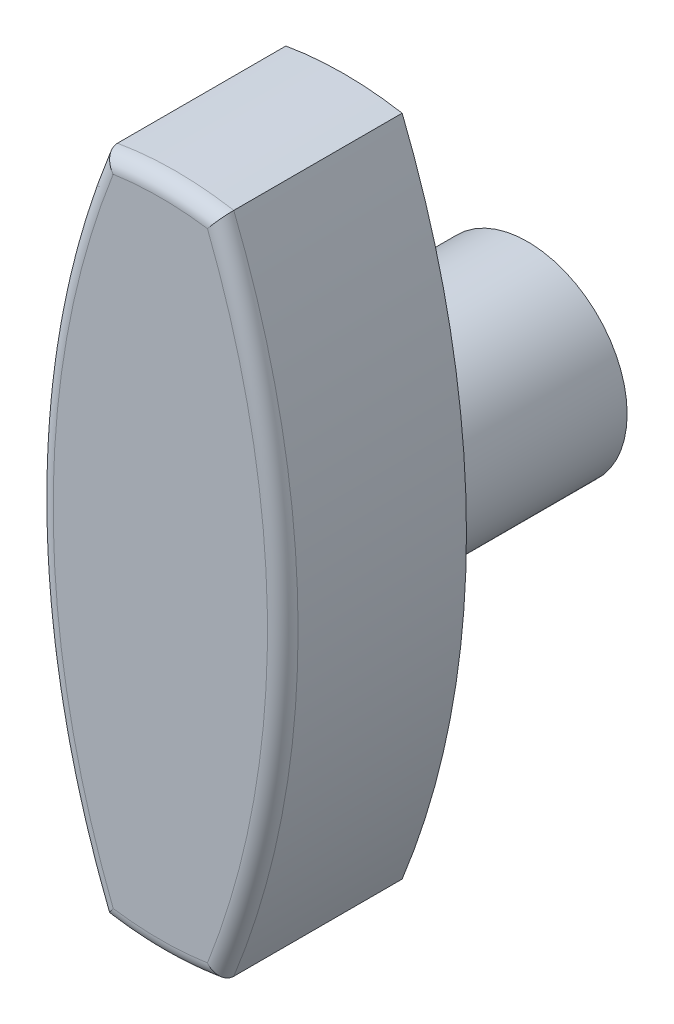
ISO-10303-21;
HEADER;
FILE_DESCRIPTION(('STEP AP214'),'2;1');
FILE_NAME('part.step','',(''),(''),'','','');
FILE_SCHEMA(('AUTOMOTIVE_DESIGN { 1 0 10303 214 1 1 1 1 }'));
ENDSEC;
DATA;
#1=APPLICATION_CONTEXT('core data for automotive mechanical design processes');
#2=APPLICATION_PROTOCOL_DEFINITION('international standard','automotive_design',2000,#1);
#3=PRODUCT_CONTEXT('',#1,'mechanical');
#4=PRODUCT('Part','Part','',(#3));
#5=PRODUCT_RELATED_PRODUCT_CATEGORY('part','',(#4));
#6=PRODUCT_DEFINITION_FORMATION('','',#4);
#7=PRODUCT_DEFINITION_CONTEXT('part definition',#1,'design');
#8=PRODUCT_DEFINITION('design','',#6,#7);
#9=PRODUCT_DEFINITION_SHAPE('','',#8);
#10=(LENGTH_UNIT() NAMED_UNIT(*) SI_UNIT(.MILLI.,.METRE.));
#11=(NAMED_UNIT(*) PLANE_ANGLE_UNIT() SI_UNIT($,.RADIAN.));
#12=(NAMED_UNIT(*) SI_UNIT($,.STERADIAN.) SOLID_ANGLE_UNIT());
#13=UNCERTAINTY_MEASURE_WITH_UNIT(LENGTH_MEASURE(1.E-05),#10,'distance_accuracy_value','');
#14=(GEOMETRIC_REPRESENTATION_CONTEXT(3) GLOBAL_UNCERTAINTY_ASSIGNED_CONTEXT((#13)) GLOBAL_UNIT_ASSIGNED_CONTEXT((#10,
#11,#12)) REPRESENTATION_CONTEXT('',''));
#15=CARTESIAN_POINT('',(0.,0.,0.));
#16=DIRECTION('',(0.,0.,1.));
#17=DIRECTION('',(1.,0.,0.));
#18=AXIS2_PLACEMENT_3D('',#15,#16,#17);
#19=CARTESIAN_POINT('',(0.,0.,0.));
#20=DIRECTION('',(0.,0.,1.));
#21=DIRECTION('',(1.,0.,0.));
#22=AXIS2_PLACEMENT_3D('',#19,#20,#21);
#23=PLANE('',#22);
#24=CARTESIAN_POINT('',(0.,0.,0.));
#25=DIRECTION('',(0.,0.,1.));
#26=DIRECTION('',(1.,0.,0.));
#27=AXIS2_PLACEMENT_3D('',#24,#25,#26);
#28=CIRCLE('',#27,6.5);
#29=CARTESIAN_POINT('',(6.5,0.,0.));
#30=VERTEX_POINT('',#29);
#31=EDGE_CURVE('E175',#30,#30,#28,.T.);
#32=ORIENTED_EDGE('',*,*,#31,.F.);
#33=EDGE_LOOP('',(#32));
#34=FACE_BOUND('',#33,.T.);
#35=CARTESIAN_POINT('',(0.,0.,0.));
#36=DIRECTION('',(0.,0.,1.));
#37=DIRECTION('',(-1.,0.,0.));
#38=AXIS2_PLACEMENT_3D('',#35,#36,#37);
#39=CIRCLE('',#38,4.);
#40=CARTESIAN_POINT('',(2.64575131106459,-3.,0.));
#41=VERTEX_POINT('',#40);
#42=CARTESIAN_POINT('',(-2.64575131106459,-3.,0.));
#43=VERTEX_POINT('',#42);
#44=EDGE_CURVE('E118',#41,#43,#39,.T.);
#45=ORIENTED_EDGE('',*,*,#44,.T.);
#46=DIRECTION('',(1.,0.,0.));
#47=VECTOR('',#46,1.);
#48=CARTESIAN_POINT('',(-2.64575131106459,-3.,0.));
#49=LINE('',#48,#47);
#50=EDGE_CURVE('E157',#43,#41,#49,.T.);
#51=ORIENTED_EDGE('',*,*,#50,.T.);
#52=EDGE_LOOP('',(#45,#51));
#53=FACE_BOUND('',#52,.T.);
#54=ADVANCED_FACE('F39',(#34,#53),#23,.F.);
#55=CARTESIAN_POINT('',(0.,0.,12.));
#56=DIRECTION('',(0.,0.,-1.));
#57=DIRECTION('',(-1.,0.,0.));
#58=AXIS2_PLACEMENT_3D('',#55,#56,#57);
#59=CYLINDRICAL_SURFACE('',#58,6.5);
#60=CARTESIAN_POINT('',(0.,0.,12.));
#61=DIRECTION('',(0.,0.,1.));
#62=DIRECTION('',(1.,0.,0.));
#63=AXIS2_PLACEMENT_3D('',#60,#61,#62);
#64=CIRCLE('',#63,6.5);
#65=CARTESIAN_POINT('',(6.5,0.,12.));
#66=VERTEX_POINT('',#65);
#67=EDGE_CURVE('E176',#66,#66,#64,.T.);
#68=ORIENTED_EDGE('',*,*,#67,.F.);
#69=EDGE_LOOP('',(#68));
#70=FACE_BOUND('',#69,.T.);
#71=ORIENTED_EDGE('',*,*,#31,.T.);
#72=EDGE_LOOP('',(#71));
#73=FACE_BOUND('',#72,.T.);
#74=ADVANCED_FACE('F263',(#70,#73),#59,.T.);
#75=CARTESIAN_POINT('',(0.,0.,12.));
#76=DIRECTION('',(0.,0.,-1.));
#77=DIRECTION('',(-1.,0.,0.));
#78=AXIS2_PLACEMENT_3D('',#75,#76,#77);
#79=CYLINDRICAL_SURFACE('',#78,4.);
#80=ORIENTED_EDGE('',*,*,#44,.F.);
#81=DIRECTION('',(0.,0.,-1.));
#82=VECTOR('',#81,1.);
#83=CARTESIAN_POINT('',(2.64575131106459,-3.,12.));
#84=LINE('',#83,#82);
#85=CARTESIAN_POINT('',(2.64575131106459,-3.,12.));
#86=VERTEX_POINT('',#85);
#87=EDGE_CURVE('E161',#86,#41,#84,.T.);
#88=ORIENTED_EDGE('',*,*,#87,.F.);
#89=CARTESIAN_POINT('',(0.,0.,12.));
#90=DIRECTION('',(0.,0.,1.));
#91=DIRECTION('',(-1.,0.,0.));
#92=AXIS2_PLACEMENT_3D('',#89,#90,#91);
#93=CIRCLE('',#92,4.);
#94=CARTESIAN_POINT('',(-2.64575131106459,-3.,12.));
#95=VERTEX_POINT('',#94);
#96=EDGE_CURVE('E152',#86,#95,#93,.T.);
#97=ORIENTED_EDGE('',*,*,#96,.T.);
#98=DIRECTION('',(0.,0.,-1.));
#99=VECTOR('',#98,1.);
#100=CARTESIAN_POINT('',(-2.64575131106459,-3.,12.));
#101=LINE('',#100,#99);
#102=EDGE_CURVE('E171',#95,#43,#101,.T.);
#103=ORIENTED_EDGE('',*,*,#102,.T.);
#104=EDGE_LOOP('',(#80,#88,#97,#103));
#105=FACE_BOUND('',#104,.T.);
#106=ADVANCED_FACE('F269',(#105),#79,.F.);
#107=CARTESIAN_POINT('',(-2.64575131106459,-3.,12.));
#108=DIRECTION('',(0.,1.,0.));
#109=DIRECTION('',(0.,0.,1.));
#110=AXIS2_PLACEMENT_3D('',#107,#108,#109);
#111=PLANE('',#110);
#112=ORIENTED_EDGE('',*,*,#50,.F.);
#113=ORIENTED_EDGE('',*,*,#102,.F.);
#114=DIRECTION('',(1.,0.,0.));
#115=VECTOR('',#114,1.);
#116=CARTESIAN_POINT('',(-2.64575131106459,-3.,12.));
#117=LINE('',#116,#115);
#118=EDGE_CURVE('E156',#95,#86,#117,.T.);
#119=ORIENTED_EDGE('',*,*,#118,.T.);
#120=ORIENTED_EDGE('',*,*,#87,.T.);
#121=EDGE_LOOP('',(#112,#113,#119,#120));
#122=FACE_BOUND('',#121,.T.);
#123=ADVANCED_FACE('F276',(#122),#111,.T.);
#124=CARTESIAN_POINT('',(25.,0.,12.));
#125=DIRECTION('',(0.,0.,1.));
#126=DIRECTION('',(1.,0.,0.));
#127=AXIS2_PLACEMENT_3D('',#124,#125,#126);
#128=PLANE('',#127);
#129=ORIENTED_EDGE('',*,*,#118,.F.);
#130=ORIENTED_EDGE('',*,*,#96,.F.);
#131=EDGE_LOOP('',(#129,#130));
#132=FACE_BOUND('',#131,.T.);
#133=ADVANCED_FACE('F260',(#132),#128,.F.);
#134=CARTESIAN_POINT('',(0.,0.,24.));
#135=DIRECTION('',(0.,0.,-1.));
#136=DIRECTION('',(-1.,0.,0.));
#137=AXIS2_PLACEMENT_3D('',#134,#135,#136);
#138=CYLINDRICAL_SURFACE('',#137,22.);
#139=DIRECTION('',(0.,0.,-1.));
#140=VECTOR('',#139,1.);
#141=CARTESIAN_POINT('',(-3.79999999999999,21.669333169251,24.));
#142=LINE('',#141,#140);
#143=CARTESIAN_POINT('',(-3.79999999999999,21.669333169251,23.));
#144=VERTEX_POINT('',#143);
#145=CARTESIAN_POINT('',(-3.79999999999999,21.669333169251,12.));
#146=VERTEX_POINT('',#145);
#147=EDGE_CURVE('E109',#144,#146,#142,.T.);
#148=ORIENTED_EDGE('',*,*,#147,.F.);
#149=CARTESIAN_POINT('',(0.,0.,23.));
#150=DIRECTION('',(0.,0.,1.));
#151=DIRECTION('',(1.,0.,0.));
#152=AXIS2_PLACEMENT_3D('',#149,#150,#151);
#153=CIRCLE('',#152,22.);
#154=CARTESIAN_POINT('',(3.79999999999999,21.669333169251,23.));
#155=VERTEX_POINT('',#154);
#156=EDGE_CURVE('E11',#144,#155,#153,.F.);
#157=ORIENTED_EDGE('',*,*,#156,.T.);
#158=DIRECTION('',(0.,0.,-1.));
#159=VECTOR('',#158,1.);
#160=CARTESIAN_POINT('',(3.79999999999999,21.669333169251,24.));
#161=LINE('',#160,#159);
#162=CARTESIAN_POINT('',(3.79999999999999,21.669333169251,12.));
#163=VERTEX_POINT('',#162);
#164=EDGE_CURVE('E132',#155,#163,#161,.T.);
#165=ORIENTED_EDGE('',*,*,#164,.T.);
#166=CARTESIAN_POINT('',(0.,0.,12.));
#167=DIRECTION('',(0.,0.,1.));
#168=DIRECTION('',(1.,0.,0.));
#169=AXIS2_PLACEMENT_3D('',#166,#167,#168);
#170=CIRCLE('',#169,22.);
#171=EDGE_CURVE('E125',#163,#146,#170,.T.);
#172=ORIENTED_EDGE('',*,*,#171,.T.);
#173=EDGE_LOOP('',(#148,#157,#165,#172));
#174=FACE_BOUND('',#173,.T.);
#175=ADVANCED_FACE('F130',(#174),#138,.T.);
#176=CARTESIAN_POINT('',(50.,0.,24.));
#177=DIRECTION('',(0.,0.,-1.));
#178=DIRECTION('',(-1.,0.,0.));
#179=AXIS2_PLACEMENT_3D('',#176,#177,#178);
#180=CYLINDRICAL_SURFACE('',#179,58.);
#181=DIRECTION('',(0.,0.,-1.));
#182=VECTOR('',#181,1.);
#183=CARTESIAN_POINT('',(-3.79999999999999,-21.669333169251,24.));
#184=LINE('',#183,#182);
#185=CARTESIAN_POINT('',(-3.79999999999999,-21.669333169251,23.));
#186=VERTEX_POINT('',#185);
#187=CARTESIAN_POINT('',(-3.79999999999999,-21.669333169251,12.));
#188=VERTEX_POINT('',#187);
#189=EDGE_CURVE('E119',#186,#188,#184,.T.);
#190=ORIENTED_EDGE('',*,*,#189,.F.);
#191=CARTESIAN_POINT('',(50.,0.,23.));
#192=DIRECTION('',(0.,0.,1.));
#193=DIRECTION('',(1.,0.,0.));
#194=AXIS2_PLACEMENT_3D('',#191,#192,#193);
#195=CIRCLE('',#194,58.);
#196=EDGE_CURVE('E54',#186,#144,#195,.F.);
#197=ORIENTED_EDGE('',*,*,#196,.T.);
#198=ORIENTED_EDGE('',*,*,#147,.T.);
#199=CARTESIAN_POINT('',(50.,0.,12.));
#200=DIRECTION('',(0.,0.,1.));
#201=DIRECTION('',(1.,0.,0.));
#202=AXIS2_PLACEMENT_3D('',#199,#200,#201);
#203=CIRCLE('',#202,58.);
#204=EDGE_CURVE('E112',#146,#188,#203,.T.);
#205=ORIENTED_EDGE('',*,*,#204,.T.);
#206=EDGE_LOOP('',(#190,#197,#198,#205));
#207=FACE_BOUND('',#206,.T.);
#208=ADVANCED_FACE('F111',(#207),#180,.T.);
#209=CARTESIAN_POINT('',(0.,0.,24.));
#210=DIRECTION('',(0.,0.,-1.));
#211=DIRECTION('',(-1.,0.,0.));
#212=AXIS2_PLACEMENT_3D('',#209,#210,#211);
#213=CYLINDRICAL_SURFACE('',#212,22.);
#214=DIRECTION('',(0.,0.,-1.));
#215=VECTOR('',#214,1.);
#216=CARTESIAN_POINT('',(3.8,-21.6693331692509,24.));
#217=LINE('',#216,#215);
#218=CARTESIAN_POINT('',(3.8,-21.6693331692509,23.));
#219=VERTEX_POINT('',#218);
#220=CARTESIAN_POINT('',(3.8,-21.6693331692509,12.));
#221=VERTEX_POINT('',#220);
#222=EDGE_CURVE('E147',#219,#221,#217,.T.);
#223=ORIENTED_EDGE('',*,*,#222,.F.);
#224=CARTESIAN_POINT('',(0.,0.,23.));
#225=DIRECTION('',(0.,0.,1.));
#226=DIRECTION('',(1.,0.,0.));
#227=AXIS2_PLACEMENT_3D('',#224,#225,#226);
#228=CIRCLE('',#227,22.);
#229=EDGE_CURVE('E69',#219,#186,#228,.F.);
#230=ORIENTED_EDGE('',*,*,#229,.T.);
#231=ORIENTED_EDGE('',*,*,#189,.T.);
#232=CARTESIAN_POINT('',(0.,0.,12.));
#233=DIRECTION('',(0.,0.,1.));
#234=DIRECTION('',(-1.,0.,0.));
#235=AXIS2_PLACEMENT_3D('',#232,#233,#234);
#236=CIRCLE('',#235,22.);
#237=EDGE_CURVE('E127',#188,#221,#236,.T.);
#238=ORIENTED_EDGE('',*,*,#237,.T.);
#239=EDGE_LOOP('',(#223,#230,#231,#238));
#240=FACE_BOUND('',#239,.T.);
#241=ADVANCED_FACE('F247',(#240),#213,.T.);
#242=CARTESIAN_POINT('',(-50.,0.,24.));
#243=DIRECTION('',(0.,0.,-1.));
#244=DIRECTION('',(-1.,0.,0.));
#245=AXIS2_PLACEMENT_3D('',#242,#243,#244);
#246=CYLINDRICAL_SURFACE('',#245,58.);
#247=ORIENTED_EDGE('',*,*,#164,.F.);
#248=CARTESIAN_POINT('',(-50.,0.,23.));
#249=DIRECTION('',(0.,0.,1.));
#250=DIRECTION('',(1.,0.,0.));
#251=AXIS2_PLACEMENT_3D('',#248,#249,#250);
#252=CIRCLE('',#251,58.);
#253=EDGE_CURVE('E196',#155,#219,#252,.F.);
#254=ORIENTED_EDGE('',*,*,#253,.T.);
#255=ORIENTED_EDGE('',*,*,#222,.T.);
#256=CARTESIAN_POINT('',(-50.,0.,12.));
#257=DIRECTION('',(0.,0.,1.));
#258=DIRECTION('',(-1.,0.,0.));
#259=AXIS2_PLACEMENT_3D('',#256,#257,#258);
#260=CIRCLE('',#259,58.);
#261=EDGE_CURVE('E142',#221,#163,#260,.T.);
#262=ORIENTED_EDGE('',*,*,#261,.T.);
#263=EDGE_LOOP('',(#247,#254,#255,#262));
#264=FACE_BOUND('',#263,.T.);
#265=ADVANCED_FACE('F246',(#264),#246,.T.);
#266=CARTESIAN_POINT('',(25.,0.,24.));
#267=DIRECTION('',(0.,0.,1.));
#268=DIRECTION('',(1.,0.,0.));
#269=AXIS2_PLACEMENT_3D('',#266,#267,#268);
#270=PLANE('',#269);
#271=CARTESIAN_POINT('',(0.,0.,24.));
#272=DIRECTION('',(0.,0.,1.));
#273=DIRECTION('',(1.,0.,0.));
#274=AXIS2_PLACEMENT_3D('',#271,#272,#273);
#275=CIRCLE('',#274,21.);
#276=CARTESIAN_POINT('',(-3.08,-20.7729054299104,24.));
#277=VERTEX_POINT('',#276);
#278=CARTESIAN_POINT('',(3.08,-20.7729054299104,24.));
#279=VERTEX_POINT('',#278);
#280=EDGE_CURVE('E189',#277,#279,#275,.T.);
#281=ORIENTED_EDGE('',*,*,#280,.T.);
#282=CARTESIAN_POINT('',(-50.,0.,24.));
#283=DIRECTION('',(0.,0.,1.));
#284=DIRECTION('',(1.,0.,0.));
#285=AXIS2_PLACEMENT_3D('',#282,#283,#284);
#286=CIRCLE('',#285,57.);
#287=CARTESIAN_POINT('',(3.07999999999999,20.7729054299104,24.));
#288=VERTEX_POINT('',#287);
#289=EDGE_CURVE('E192',#279,#288,#286,.T.);
#290=ORIENTED_EDGE('',*,*,#289,.T.);
#291=CARTESIAN_POINT('',(0.,0.,24.));
#292=DIRECTION('',(0.,0.,1.));
#293=DIRECTION('',(1.,0.,0.));
#294=AXIS2_PLACEMENT_3D('',#291,#292,#293);
#295=CIRCLE('',#294,21.);
#296=CARTESIAN_POINT('',(-3.07999999999999,20.7729054299104,24.));
#297=VERTEX_POINT('',#296);
#298=EDGE_CURVE('E180',#288,#297,#295,.T.);
#299=ORIENTED_EDGE('',*,*,#298,.T.);
#300=CARTESIAN_POINT('',(50.,0.,24.));
#301=DIRECTION('',(0.,0.,1.));
#302=DIRECTION('',(1.,0.,0.));
#303=AXIS2_PLACEMENT_3D('',#300,#301,#302);
#304=CIRCLE('',#303,57.);
#305=EDGE_CURVE('E186',#297,#277,#304,.T.);
#306=ORIENTED_EDGE('',*,*,#305,.T.);
#307=EDGE_LOOP('',(#281,#290,#299,#306));
#308=FACE_BOUND('',#307,.T.);
#309=ADVANCED_FACE('F251',(#308),#270,.T.);
#310=ORIENTED_EDGE('',*,*,#67,.T.);
#311=EDGE_LOOP('',(#310));
#312=FACE_BOUND('',#311,.T.);
#313=ORIENTED_EDGE('',*,*,#171,.F.);
#314=ORIENTED_EDGE('',*,*,#261,.F.);
#315=ORIENTED_EDGE('',*,*,#237,.F.);
#316=ORIENTED_EDGE('',*,*,#204,.F.);
#317=EDGE_LOOP('',(#313,#314,#315,#316));
#318=FACE_BOUND('',#317,.T.);
#319=ADVANCED_FACE('F123',(#312,#318),#128,.F.);
#320=CARTESIAN_POINT('',(50.,0.,23.));
#321=DIRECTION('',(0.,0.,1.));
#322=DIRECTION('',(1.,0.,0.));
#323=AXIS2_PLACEMENT_3D('',#320,#321,#322);
#324=TOROIDAL_SURFACE('',#323,57.,1.);
#325=CARTESIAN_POINT('',(-3.79999999999999,21.669333169251,23.));
#326=CARTESIAN_POINT('',(-3.8000010307423,21.6693343740401,23.0255772737413));
#327=CARTESIAN_POINT('',(-3.7992929329031,21.6684601459804,23.0511412762187));
#328=CARTESIAN_POINT('',(-3.7964758081642,21.6649816501608,23.1020659623001));
#329=CARTESIAN_POINT('',(-3.79436720784141,21.6623779091907,23.1274267054349));
#330=CARTESIAN_POINT('',(-3.78599305290856,21.6520362689148,23.2027190061008));
#331=CARTESIAN_POINT('',(-3.77767875894121,21.6417674866968,23.252111118588));
#332=CARTESIAN_POINT('',(-3.75598919636384,21.6149670730527,23.3479087260971));
#333=CARTESIAN_POINT('',(-3.7426176673251,21.5984400692561,23.3943163983665));
#334=CARTESIAN_POINT('',(-3.71138872570344,21.559818015024,23.4831574590286));
#335=CARTESIAN_POINT('',(-3.69352800057128,21.5377188528898,23.5255878807508));
#336=CARTESIAN_POINT('',(-3.65305289997418,21.4876014551726,23.6075519041551));
#337=CARTESIAN_POINT('',(-3.6302523080575,21.4593510297602,23.6468505453043));
#338=CARTESIAN_POINT('',(-3.581259573902,21.3985927805524,23.7195809235014));
#339=CARTESIAN_POINT('',(-3.55506656291715,21.3660838661994,23.7530111525568));
#340=CARTESIAN_POINT('',(-3.49674764749466,21.2936292163405,23.8172841486273));
#341=CARTESIAN_POINT('',(-3.46428671206695,21.2532589220769,23.847343395703));
#342=CARTESIAN_POINT('',(-3.39697054460452,21.1694367718397,23.8994781575032));
#343=CARTESIAN_POINT('',(-3.36211294549775,21.1259818679289,23.9215456403531));
#344=CARTESIAN_POINT('',(-3.28727465173541,21.0325625935942,23.9594194021452));
#345=CARTESIAN_POINT('',(-3.24713157762793,20.9823834248934,23.974371159456));
#346=CARTESIAN_POINT('',(-3.16603969983965,20.880864473455,23.9944758733525));
#347=CARTESIAN_POINT('',(-3.12509273933727,20.82952731286,23.9996490825356));
#348=CARTESIAN_POINT('',(-3.08281961034065,20.7764462114535,23.9999942583938));
#349=CARTESIAN_POINT('',(-3.08140974446491,20.7746757914084,24.0000000094948));
#350=CARTESIAN_POINT('',(-3.07999999999999,20.7729054299104,24.));
#351=B_SPLINE_CURVE_WITH_KNOTS('',3,(#325,#326,#327,#328,#329,#330,#331,#332,#333,#334,#335,
#336,#337,#338,#339,#340,#341,#342,#343,#344,#345,#346,#347,#348,#349,#350),.UNSPECIFIED.,.F.,
.F.,(4,2,2,2,2,2,2,2,2,2,2,2,4),(0.,0.0766812268984121,0.153339108283288,0.30591365460639,
0.458375599601565,0.610950377280639,0.770808258981302,0.930707159055196,1.10966746765817,
1.28880713888053,1.48599024615679,1.68276451313895,1.6895541234587),.UNSPECIFIED.);
#352=EDGE_CURVE('E138',#144,#297,#351,.T.);
#353=ORIENTED_EDGE('',*,*,#352,.F.);
#354=ORIENTED_EDGE('',*,*,#196,.F.);
#355=CARTESIAN_POINT('',(-3.79999999999999,-21.669333169251,23.));
#356=CARTESIAN_POINT('',(-3.8000010307423,-21.6693343740401,23.0255772737413));
#357=CARTESIAN_POINT('',(-3.7992929329031,-21.6684601459804,23.0511412762187));
#358=CARTESIAN_POINT('',(-3.79647580816421,-21.6649816501608,23.1020659623001));
#359=CARTESIAN_POINT('',(-3.79436720784142,-21.6623779091907,23.1274267054349));
#360=CARTESIAN_POINT('',(-3.78599305290857,-21.6520362689148,23.2027190061008));
#361=CARTESIAN_POINT('',(-3.77767875894121,-21.6417674866969,23.252111118588));
#362=CARTESIAN_POINT('',(-3.75598919636384,-21.6149670730527,23.3479087260971));
#363=CARTESIAN_POINT('',(-3.7426176673251,-21.5984400692561,23.3943163983665));
#364=CARTESIAN_POINT('',(-3.71138872570345,-21.559818015024,23.4831574590286));
#365=CARTESIAN_POINT('',(-3.69352800057129,-21.5377188528898,23.5255878807508));
#366=CARTESIAN_POINT('',(-3.65305289997419,-21.4876014551726,23.6075519041551));
#367=CARTESIAN_POINT('',(-3.63025230805751,-21.4593510297602,23.6468505453044));
#368=CARTESIAN_POINT('',(-3.58125957390202,-21.3985927805524,23.7195809235014));
#369=CARTESIAN_POINT('',(-3.55506656291716,-21.3660838661994,23.7530111525568));
#370=CARTESIAN_POINT('',(-3.49674764749467,-21.2936292163405,23.8172841486273));
#371=CARTESIAN_POINT('',(-3.46428671206696,-21.2532589220769,23.847343395703));
#372=CARTESIAN_POINT('',(-3.39697054460452,-21.1694367718397,23.8994781575032));
#373=CARTESIAN_POINT('',(-3.36211294549775,-21.1259818679289,23.9215456403531));
#374=CARTESIAN_POINT('',(-3.28727465173543,-21.0325625935942,23.9594194021452));
#375=CARTESIAN_POINT('',(-3.247131577628,-20.9823834248933,23.974371159456));
#376=CARTESIAN_POINT('',(-3.1660396998396,-20.8808644734551,23.9944758733525));
#377=CARTESIAN_POINT('',(-3.12509273933706,-20.8295273128602,23.9996490825356));
#378=CARTESIAN_POINT('',(-3.08281961034065,-20.7764462114536,23.9999942583938));
#379=CARTESIAN_POINT('',(-3.08140974446492,-20.7746757914084,24.0000000094948));
#380=CARTESIAN_POINT('',(-3.08,-20.7729054299104,24.));
#381=B_SPLINE_CURVE_WITH_KNOTS('',3,(#355,#356,#357,#358,#359,#360,#361,#362,#363,#364,#365,
#366,#367,#368,#369,#370,#371,#372,#373,#374,#375,#376,#377,#378,#379,#380),.UNSPECIFIED.,.F.,
.F.,(4,2,2,2,2,2,2,2,2,2,2,2,4),(0.,0.0766812268984086,0.153339108283288,0.305913654606389,
0.458375599601564,0.610950377280639,0.770808258981297,0.930707159055197,1.10966746765817,
1.28880713888053,1.48599024615679,1.68276451313895,1.68955412345869),.UNSPECIFIED.);
#382=EDGE_CURVE('E44',#277,#186,#381,.F.);
#383=ORIENTED_EDGE('',*,*,#382,.F.);
#384=ORIENTED_EDGE('',*,*,#305,.F.);
#385=EDGE_LOOP('',(#353,#354,#383,#384));
#386=FACE_BOUND('',#385,.T.);
#387=ADVANCED_FACE('F41',(#386),#324,.T.);
#388=CARTESIAN_POINT('',(0.,0.,23.));
#389=DIRECTION('',(0.,0.,1.));
#390=DIRECTION('',(1.,0.,0.));
#391=AXIS2_PLACEMENT_3D('',#388,#389,#390);
#392=TOROIDAL_SURFACE('',#391,21.,1.);
#393=ORIENTED_EDGE('',*,*,#382,.T.);
#394=ORIENTED_EDGE('',*,*,#229,.F.);
#395=CARTESIAN_POINT('',(3.80000000000001,-21.669333169251,23.));
#396=CARTESIAN_POINT('',(3.80000103074231,-21.6693343740401,23.0255772737413));
#397=CARTESIAN_POINT('',(3.79929293290311,-21.6684601459804,23.0511412762187));
#398=CARTESIAN_POINT('',(3.79647580816421,-21.6649816501608,23.1020659623001));
#399=CARTESIAN_POINT('',(3.79436720784142,-21.6623779091907,23.1274267054349));
#400=CARTESIAN_POINT('',(3.78599305290857,-21.6520362689148,23.2027190061008));
#401=CARTESIAN_POINT('',(3.7776787589412,-21.6417674866969,23.252111118588));
#402=CARTESIAN_POINT('',(3.75598919636384,-21.6149670730527,23.3479087260971));
#403=CARTESIAN_POINT('',(3.7426176673251,-21.5984400692561,23.3943163983665));
#404=CARTESIAN_POINT('',(3.71138872570345,-21.559818015024,23.4831574590286));
#405=CARTESIAN_POINT('',(3.69352800057129,-21.5377188528898,23.5255878807508));
#406=CARTESIAN_POINT('',(3.65305289997419,-21.4876014551726,23.6075519041551));
#407=CARTESIAN_POINT('',(3.63025230805751,-21.4593510297602,23.6468505453043));
#408=CARTESIAN_POINT('',(3.58125957390202,-21.3985927805524,23.7195809235014));
#409=CARTESIAN_POINT('',(3.55506656291717,-21.3660838661994,23.7530111525568));
#410=CARTESIAN_POINT('',(3.49674764749467,-21.2936292163405,23.8172841486273));
#411=CARTESIAN_POINT('',(3.46428671206696,-21.2532589220769,23.847343395703));
#412=CARTESIAN_POINT('',(3.39697054460453,-21.1694367718397,23.8994781575032));
#413=CARTESIAN_POINT('',(3.36211294549777,-21.1259818679289,23.9215456403531));
#414=CARTESIAN_POINT('',(3.28727465173544,-21.0325625935942,23.9594194021452));
#415=CARTESIAN_POINT('',(3.24713157762796,-20.9823834248934,23.974371159456));
#416=CARTESIAN_POINT('',(3.16603969983964,-20.880864473455,23.9944758733525));
#417=CARTESIAN_POINT('',(3.12509273933721,-20.8295273128601,23.9996490825356));
#418=CARTESIAN_POINT('',(3.08281961034066,-20.7764462114536,23.9999942583938));
#419=CARTESIAN_POINT('',(3.08140974446492,-20.7746757914084,24.0000000094948));
#420=CARTESIAN_POINT('',(3.08,-20.7729054299104,24.));
#421=B_SPLINE_CURVE_WITH_KNOTS('',3,(#395,#396,#397,#398,#399,#400,#401,#402,#403,#404,#405,
#406,#407,#408,#409,#410,#411,#412,#413,#414,#415,#416,#417,#418,#419,#420),.UNSPECIFIED.,.F.,
.F.,(4,2,2,2,2,2,2,2,2,2,2,2,4),(0.,0.0766812268984086,0.153339108283288,0.30591365460639,
0.458375599601565,0.610950377280637,0.770808258981295,0.930707159055192,1.10966746765817,
1.28880713888053,1.48599024615678,1.68276451313895,1.68955412345869),.UNSPECIFIED.);
#422=EDGE_CURVE('E213',#279,#219,#421,.F.);
#423=ORIENTED_EDGE('',*,*,#422,.F.);
#424=ORIENTED_EDGE('',*,*,#280,.F.);
#425=EDGE_LOOP('',(#393,#394,#423,#424));
#426=FACE_BOUND('',#425,.T.);
#427=ADVANCED_FACE('F224',(#426),#392,.T.);
#428=CARTESIAN_POINT('',(0.,0.,23.));
#429=DIRECTION('',(0.,0.,1.));
#430=DIRECTION('',(1.,0.,0.));
#431=AXIS2_PLACEMENT_3D('',#428,#429,#430);
#432=TOROIDAL_SURFACE('',#431,21.,1.);
#433=ORIENTED_EDGE('',*,*,#352,.T.);
#434=ORIENTED_EDGE('',*,*,#298,.F.);
#435=CARTESIAN_POINT('',(3.79999999999999,21.669333169251,23.));
#436=CARTESIAN_POINT('',(3.8000010307423,21.6693343740401,23.0255772737413));
#437=CARTESIAN_POINT('',(3.7992929329031,21.6684601459804,23.0511412762187));
#438=CARTESIAN_POINT('',(3.7964758081642,21.6649816501608,23.1020659623001));
#439=CARTESIAN_POINT('',(3.79436720784141,21.6623779091907,23.1274267054349));
#440=CARTESIAN_POINT('',(3.78599305290856,21.6520362689148,23.2027190061008));
#441=CARTESIAN_POINT('',(3.77767875894121,21.6417674866968,23.252111118588));
#442=CARTESIAN_POINT('',(3.75598919636384,21.6149670730527,23.3479087260971));
#443=CARTESIAN_POINT('',(3.7426176673251,21.5984400692561,23.3943163983665));
#444=CARTESIAN_POINT('',(3.71138872570344,21.559818015024,23.4831574590286));
#445=CARTESIAN_POINT('',(3.69352800057128,21.5377188528898,23.5255878807508));
#446=CARTESIAN_POINT('',(3.65305289997418,21.4876014551726,23.6075519041551));
#447=CARTESIAN_POINT('',(3.6302523080575,21.4593510297602,23.6468505453043));
#448=CARTESIAN_POINT('',(3.581259573902,21.3985927805524,23.7195809235014));
#449=CARTESIAN_POINT('',(3.55506656291715,21.3660838661994,23.7530111525568));
#450=CARTESIAN_POINT('',(3.49674764749466,21.2936292163405,23.8172841486273));
#451=CARTESIAN_POINT('',(3.46428671206695,21.2532589220769,23.847343395703));
#452=CARTESIAN_POINT('',(3.39697054460452,21.1694367718397,23.8994781575032));
#453=CARTESIAN_POINT('',(3.36211294549775,21.1259818679289,23.9215456403531));
#454=CARTESIAN_POINT('',(3.28727465173541,21.0325625935942,23.9594194021452));
#455=CARTESIAN_POINT('',(3.24713157762793,20.9823834248934,23.974371159456));
#456=CARTESIAN_POINT('',(3.16603969983965,20.880864473455,23.9944758733525));
#457=CARTESIAN_POINT('',(3.12509273933727,20.82952731286,23.9996490825356));
#458=CARTESIAN_POINT('',(3.08281961034065,20.7764462114535,23.9999942583938));
#459=CARTESIAN_POINT('',(3.08140974446491,20.7746757914084,24.0000000094948));
#460=CARTESIAN_POINT('',(3.07999999999999,20.7729054299104,24.));
#461=B_SPLINE_CURVE_WITH_KNOTS('',3,(#435,#436,#437,#438,#439,#440,#441,#442,#443,#444,#445,
#446,#447,#448,#449,#450,#451,#452,#453,#454,#455,#456,#457,#458,#459,#460),.UNSPECIFIED.,.F.,
.F.,(4,2,2,2,2,2,2,2,2,2,2,2,4),(0.,0.0766812268984121,0.153339108283288,0.30591365460639,
0.458375599601565,0.610950377280639,0.770808258981302,0.930707159055196,1.10966746765817,
1.28880713888053,1.48599024615679,1.68276451313895,1.6895541234587),.UNSPECIFIED.);
#462=EDGE_CURVE('E204',#155,#288,#461,.T.);
#463=ORIENTED_EDGE('',*,*,#462,.F.);
#464=ORIENTED_EDGE('',*,*,#156,.F.);
#465=EDGE_LOOP('',(#433,#434,#463,#464));
#466=FACE_BOUND('',#465,.T.);
#467=ADVANCED_FACE('F221',(#466),#432,.T.);
#468=CARTESIAN_POINT('',(-50.,0.,23.));
#469=DIRECTION('',(0.,0.,1.));
#470=DIRECTION('',(1.,0.,0.));
#471=AXIS2_PLACEMENT_3D('',#468,#469,#470);
#472=TOROIDAL_SURFACE('',#471,57.,1.);
#473=ORIENTED_EDGE('',*,*,#422,.T.);
#474=ORIENTED_EDGE('',*,*,#253,.F.);
#475=ORIENTED_EDGE('',*,*,#462,.T.);
#476=ORIENTED_EDGE('',*,*,#289,.F.);
#477=EDGE_LOOP('',(#473,#474,#475,#476));
#478=FACE_BOUND('',#477,.T.);
#479=ADVANCED_FACE('F218',(#478),#472,.T.);
#480=CLOSED_SHELL('',(#54,#74,#106,#123,#133,#175,#208,#241,#265,#309,#319,#387,#427,#467,#479));
#481=MANIFOLD_SOLID_BREP('B2',#480);
#482=ADVANCED_BREP_SHAPE_REPRESENTATION('',(#18,#481),#14);
#483=SHAPE_DEFINITION_REPRESENTATION(#9,#482);
ENDSEC;
END-ISO-10303-21;
